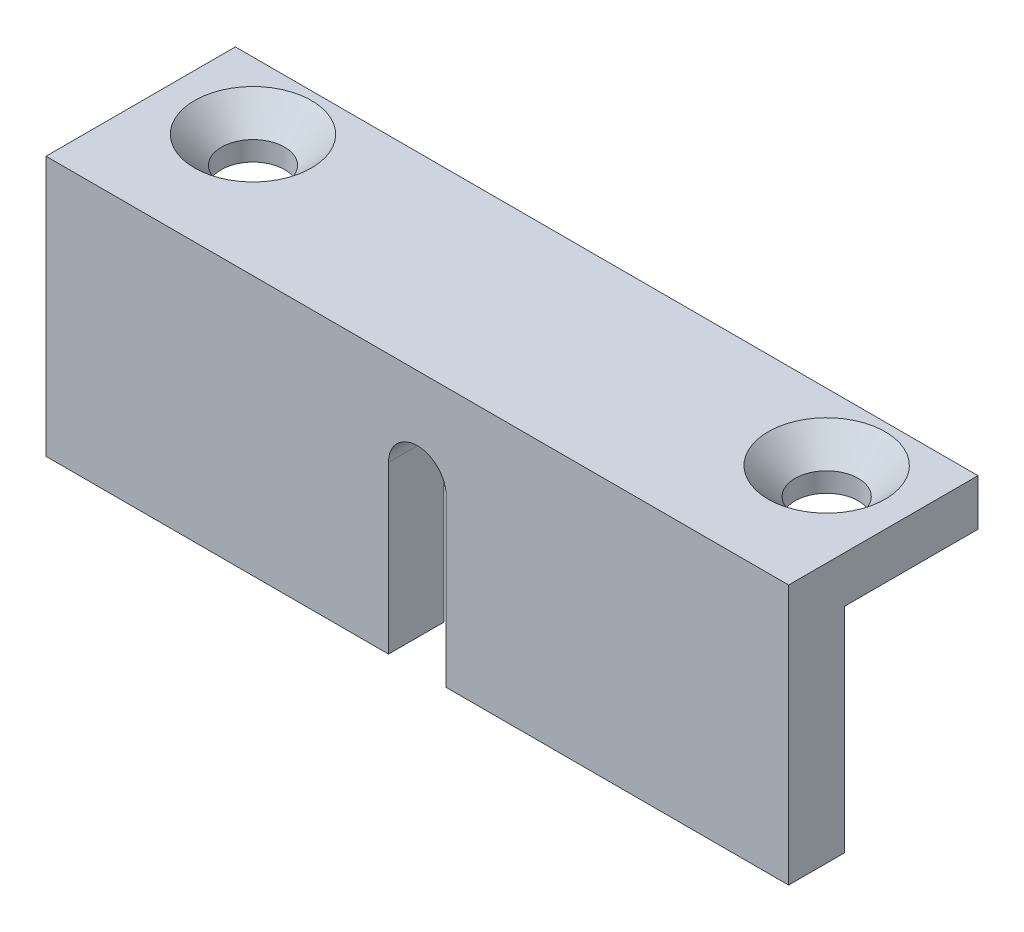
ISO-10303-21;
HEADER;
FILE_DESCRIPTION(('STEP AP214'),'2;1');
FILE_NAME('part.step','',(''),(''),'','','');
FILE_SCHEMA(('AUTOMOTIVE_DESIGN { 1 0 10303 214 1 1 1 1 }'));
ENDSEC;
DATA;
#1=APPLICATION_CONTEXT('core data for automotive mechanical design processes');
#2=APPLICATION_PROTOCOL_DEFINITION('international standard','automotive_design',2000,#1);
#3=PRODUCT_CONTEXT('',#1,'mechanical');
#4=PRODUCT('Part','Part','',(#3));
#5=PRODUCT_RELATED_PRODUCT_CATEGORY('part','',(#4));
#6=PRODUCT_DEFINITION_FORMATION('','',#4);
#7=PRODUCT_DEFINITION_CONTEXT('part definition',#1,'design');
#8=PRODUCT_DEFINITION('design','',#6,#7);
#9=PRODUCT_DEFINITION_SHAPE('','',#8);
#10=(LENGTH_UNIT() NAMED_UNIT(*) SI_UNIT(.MILLI.,.METRE.));
#11=(NAMED_UNIT(*) PLANE_ANGLE_UNIT() SI_UNIT($,.RADIAN.));
#12=(NAMED_UNIT(*) SI_UNIT($,.STERADIAN.) SOLID_ANGLE_UNIT());
#13=UNCERTAINTY_MEASURE_WITH_UNIT(LENGTH_MEASURE(1.E-05),#10,'distance_accuracy_value','');
#14=(GEOMETRIC_REPRESENTATION_CONTEXT(3) GLOBAL_UNCERTAINTY_ASSIGNED_CONTEXT((#13)) GLOBAL_UNIT_ASSIGNED_CONTEXT((#10,
#11,#12)) REPRESENTATION_CONTEXT('',''));
#15=CARTESIAN_POINT('',(0.,0.,0.));
#16=DIRECTION('',(0.,0.,1.));
#17=DIRECTION('',(1.,0.,0.));
#18=AXIS2_PLACEMENT_3D('',#15,#16,#17);
#19=CARTESIAN_POINT('',(0.,-11.5,0.));
#20=DIRECTION('',(0.,1.,0.));
#21=DIRECTION('',(0.,0.,1.));
#22=AXIS2_PLACEMENT_3D('',#19,#20,#21);
#23=PLANE('',#22);
#24=DIRECTION('',(0.,0.,-1.));
#25=VECTOR('',#24,1.);
#26=CARTESIAN_POINT('',(18.45,-11.5,0.));
#27=LINE('',#26,#25);
#28=CARTESIAN_POINT('',(18.45,-11.5,3.));
#29=VERTEX_POINT('',#28);
#30=CARTESIAN_POINT('',(18.45,-11.5,0.));
#31=VERTEX_POINT('',#30);
#32=EDGE_CURVE('E49',#29,#31,#27,.T.);
#33=ORIENTED_EDGE('',*,*,#32,.F.);
#34=DIRECTION('',(1.,0.,0.));
#35=VECTOR('',#34,1.);
#36=CARTESIAN_POINT('',(0.,-11.5,3.));
#37=LINE('',#36,#35);
#38=CARTESIAN_POINT('',(0.,-11.5,3.));
#39=VERTEX_POINT('',#38);
#40=EDGE_CURVE('E153',#39,#29,#37,.T.);
#41=ORIENTED_EDGE('',*,*,#40,.F.);
#42=DIRECTION('',(0.,0.,1.));
#43=VECTOR('',#42,1.);
#44=CARTESIAN_POINT('',(0.,-11.5,0.));
#45=LINE('',#44,#43);
#46=CARTESIAN_POINT('',(0.,-11.5,0.));
#47=VERTEX_POINT('',#46);
#48=EDGE_CURVE('E141',#47,#39,#45,.T.);
#49=ORIENTED_EDGE('',*,*,#48,.F.);
#50=DIRECTION('',(-1.,0.,0.));
#51=VECTOR('',#50,1.);
#52=CARTESIAN_POINT('',(40.,-11.5,0.));
#53=LINE('',#52,#51);
#54=EDGE_CURVE('E133',#31,#47,#53,.T.);
#55=ORIENTED_EDGE('',*,*,#54,.F.);
#56=EDGE_LOOP('',(#33,#41,#49,#55));
#57=FACE_BOUND('',#56,.T.);
#58=ADVANCED_FACE('F41',(#57),#23,.F.);
#59=CARTESIAN_POINT('',(0.,2.5,0.));
#60=DIRECTION('',(1.,0.,0.));
#61=DIRECTION('',(0.,0.,-1.));
#62=AXIS2_PLACEMENT_3D('',#59,#60,#61);
#63=PLANE('',#62);
#64=DIRECTION('',(0.,0.,1.));
#65=VECTOR('',#64,1.);
#66=CARTESIAN_POINT('',(0.,0.,0.));
#67=LINE('',#66,#65);
#68=CARTESIAN_POINT('',(0.,0.,-7.2));
#69=VERTEX_POINT('',#68);
#70=CARTESIAN_POINT('',(0.,0.,0.));
#71=VERTEX_POINT('',#70);
#72=EDGE_CURVE('E97',#69,#71,#67,.T.);
#73=ORIENTED_EDGE('',*,*,#72,.T.);
#74=DIRECTION('',(0.,1.,0.));
#75=VECTOR('',#74,1.);
#76=CARTESIAN_POINT('',(0.,-11.5,0.));
#77=LINE('',#76,#75);
#78=EDGE_CURVE('E157',#47,#71,#77,.T.);
#79=ORIENTED_EDGE('',*,*,#78,.F.);
#80=ORIENTED_EDGE('',*,*,#48,.T.);
#81=DIRECTION('',(0.,1.,0.));
#82=VECTOR('',#81,1.);
#83=CARTESIAN_POINT('',(0.,-11.5,3.));
#84=LINE('',#83,#82);
#85=CARTESIAN_POINT('',(0.,2.5,3.));
#86=VERTEX_POINT('',#85);
#87=EDGE_CURVE('E166',#39,#86,#84,.T.);
#88=ORIENTED_EDGE('',*,*,#87,.T.);
#89=DIRECTION('',(0.,0.,1.));
#90=VECTOR('',#89,1.);
#91=CARTESIAN_POINT('',(0.,2.5,0.));
#92=LINE('',#91,#90);
#93=CARTESIAN_POINT('',(0.,2.5,-7.2));
#94=VERTEX_POINT('',#93);
#95=EDGE_CURVE('E91',#94,#86,#92,.T.);
#96=ORIENTED_EDGE('',*,*,#95,.F.);
#97=DIRECTION('',(0.,-1.,0.));
#98=VECTOR('',#97,1.);
#99=CARTESIAN_POINT('',(0.,2.5,-7.2));
#100=LINE('',#99,#98);
#101=EDGE_CURVE('E84',#94,#69,#100,.T.);
#102=ORIENTED_EDGE('',*,*,#101,.T.);
#103=EDGE_LOOP('',(#73,#79,#80,#88,#96,#102));
#104=FACE_BOUND('',#103,.T.);
#105=ADVANCED_FACE('F43',(#104),#63,.F.);
#106=CARTESIAN_POINT('',(40.,2.5,0.));
#107=DIRECTION('',(-1.,0.,0.));
#108=DIRECTION('',(0.,0.,1.));
#109=AXIS2_PLACEMENT_3D('',#106,#107,#108);
#110=PLANE('',#109);
#111=DIRECTION('',(0.,0.,-1.));
#112=VECTOR('',#111,1.);
#113=CARTESIAN_POINT('',(40.,0.,0.));
#114=LINE('',#113,#112);
#115=CARTESIAN_POINT('',(40.,0.,0.));
#116=VERTEX_POINT('',#115);
#117=CARTESIAN_POINT('',(40.,0.,-7.2));
#118=VERTEX_POINT('',#117);
#119=EDGE_CURVE('E92',#116,#118,#114,.T.);
#120=ORIENTED_EDGE('',*,*,#119,.T.);
#121=DIRECTION('',(0.,-1.,0.));
#122=VECTOR('',#121,1.);
#123=CARTESIAN_POINT('',(40.,2.5,-7.2));
#124=LINE('',#123,#122);
#125=CARTESIAN_POINT('',(40.,2.5,-7.2));
#126=VERTEX_POINT('',#125);
#127=EDGE_CURVE('E87',#126,#118,#124,.T.);
#128=ORIENTED_EDGE('',*,*,#127,.F.);
#129=DIRECTION('',(0.,0.,-1.));
#130=VECTOR('',#129,1.);
#131=CARTESIAN_POINT('',(40.,2.5,0.));
#132=LINE('',#131,#130);
#133=CARTESIAN_POINT('',(40.,2.5,3.));
#134=VERTEX_POINT('',#133);
#135=EDGE_CURVE('E182',#134,#126,#132,.T.);
#136=ORIENTED_EDGE('',*,*,#135,.F.);
#137=DIRECTION('',(0.,1.,0.));
#138=VECTOR('',#137,1.);
#139=CARTESIAN_POINT('',(40.,-11.5,3.));
#140=LINE('',#139,#138);
#141=CARTESIAN_POINT('',(40.,-11.5,3.));
#142=VERTEX_POINT('',#141);
#143=EDGE_CURVE('E163',#142,#134,#140,.T.);
#144=ORIENTED_EDGE('',*,*,#143,.F.);
#145=DIRECTION('',(0.,0.,-1.));
#146=VECTOR('',#145,1.);
#147=CARTESIAN_POINT('',(40.,-11.5,3.));
#148=LINE('',#147,#146);
#149=CARTESIAN_POINT('',(40.,-11.5,0.));
#150=VERTEX_POINT('',#149);
#151=EDGE_CURVE('E155',#142,#150,#148,.T.);
#152=ORIENTED_EDGE('',*,*,#151,.T.);
#153=DIRECTION('',(0.,1.,0.));
#154=VECTOR('',#153,1.);
#155=CARTESIAN_POINT('',(40.,-11.5,0.));
#156=LINE('',#155,#154);
#157=EDGE_CURVE('E159',#150,#116,#156,.T.);
#158=ORIENTED_EDGE('',*,*,#157,.T.);
#159=EDGE_LOOP('',(#120,#128,#136,#144,#152,#158));
#160=FACE_BOUND('',#159,.T.);
#161=ADVANCED_FACE('F189',(#160),#110,.F.);
#162=CARTESIAN_POINT('',(0.,2.5,-7.2));
#163=DIRECTION('',(0.,0.,1.));
#164=DIRECTION('',(1.,0.,0.));
#165=AXIS2_PLACEMENT_3D('',#162,#163,#164);
#166=PLANE('',#165);
#167=DIRECTION('',(-1.,0.,0.));
#168=VECTOR('',#167,1.);
#169=CARTESIAN_POINT('',(0.,0.,-7.2));
#170=LINE('',#169,#168);
#171=EDGE_CURVE('E81',#118,#69,#170,.T.);
#172=ORIENTED_EDGE('',*,*,#171,.T.);
#173=ORIENTED_EDGE('',*,*,#101,.F.);
#174=DIRECTION('',(-1.,0.,0.));
#175=VECTOR('',#174,1.);
#176=CARTESIAN_POINT('',(0.,2.5,-7.2));
#177=LINE('',#176,#175);
#178=EDGE_CURVE('E65',#126,#94,#177,.T.);
#179=ORIENTED_EDGE('',*,*,#178,.F.);
#180=ORIENTED_EDGE('',*,*,#127,.T.);
#181=EDGE_LOOP('',(#172,#173,#179,#180));
#182=FACE_BOUND('',#181,.T.);
#183=ADVANCED_FACE('F83',(#182),#166,.F.);
#184=CARTESIAN_POINT('',(0.,2.5,0.));
#185=DIRECTION('',(0.,-1.,0.));
#186=DIRECTION('',(0.,0.,-1.));
#187=AXIS2_PLACEMENT_3D('',#184,#185,#186);
#188=PLANE('',#187);
#189=CARTESIAN_POINT('',(4.55,2.5,-3.6));
#190=DIRECTION('',(0.,1.,0.));
#191=DIRECTION('',(0.,0.,1.));
#192=AXIS2_PLACEMENT_3D('',#189,#190,#191);
#193=CIRCLE('',#192,3.15);
#194=CARTESIAN_POINT('',(4.55,2.5,-0.45));
#195=VERTEX_POINT('',#194);
#196=EDGE_CURVE('E162',#195,#195,#193,.T.);
#197=ORIENTED_EDGE('',*,*,#196,.F.);
#198=EDGE_LOOP('',(#197));
#199=FACE_BOUND('',#198,.T.);
#200=CARTESIAN_POINT('',(35.45,2.5,-3.6));
#201=DIRECTION('',(0.,1.,0.));
#202=DIRECTION('',(0.,0.,1.));
#203=AXIS2_PLACEMENT_3D('',#200,#201,#202);
#204=CIRCLE('',#203,3.15);
#205=CARTESIAN_POINT('',(35.45,2.5,-0.450000000000004));
#206=VERTEX_POINT('',#205);
#207=EDGE_CURVE('E177',#206,#206,#204,.T.);
#208=ORIENTED_EDGE('',*,*,#207,.F.);
#209=EDGE_LOOP('',(#208));
#210=FACE_BOUND('',#209,.T.);
#211=ORIENTED_EDGE('',*,*,#95,.T.);
#212=DIRECTION('',(1.,0.,0.));
#213=VECTOR('',#212,1.);
#214=CARTESIAN_POINT('',(0.,2.5,3.));
#215=LINE('',#214,#213);
#216=EDGE_CURVE('E143',#86,#134,#215,.T.);
#217=ORIENTED_EDGE('',*,*,#216,.T.);
#218=ORIENTED_EDGE('',*,*,#135,.T.);
#219=ORIENTED_EDGE('',*,*,#178,.T.);
#220=EDGE_LOOP('',(#211,#217,#218,#219));
#221=FACE_BOUND('',#220,.T.);
#222=ADVANCED_FACE('F184',(#199,#210,#221),#188,.F.);
#223=CARTESIAN_POINT('',(0.,0.,0.));
#224=DIRECTION('',(0.,-1.,0.));
#225=DIRECTION('',(0.,0.,-1.));
#226=AXIS2_PLACEMENT_3D('',#223,#224,#225);
#227=PLANE('',#226);
#228=CARTESIAN_POINT('',(4.55,0.,-3.6));
#229=DIRECTION('',(0.,1.,0.));
#230=DIRECTION('',(0.,0.,1.));
#231=AXIS2_PLACEMENT_3D('',#228,#229,#230);
#232=CIRCLE('',#231,1.7);
#233=CARTESIAN_POINT('',(4.55,0.,-1.9));
#234=VERTEX_POINT('',#233);
#235=EDGE_CURVE('E174',#234,#234,#232,.T.);
#236=ORIENTED_EDGE('',*,*,#235,.T.);
#237=EDGE_LOOP('',(#236));
#238=FACE_BOUND('',#237,.T.);
#239=CARTESIAN_POINT('',(35.45,0.,-3.6));
#240=DIRECTION('',(0.,1.,0.));
#241=DIRECTION('',(0.,0.,1.));
#242=AXIS2_PLACEMENT_3D('',#239,#240,#241);
#243=CIRCLE('',#242,1.7);
#244=CARTESIAN_POINT('',(35.45,0.,-1.9));
#245=VERTEX_POINT('',#244);
#246=EDGE_CURVE('E104',#245,#245,#243,.T.);
#247=ORIENTED_EDGE('',*,*,#246,.T.);
#248=EDGE_LOOP('',(#247));
#249=FACE_BOUND('',#248,.T.);
#250=ORIENTED_EDGE('',*,*,#72,.F.);
#251=ORIENTED_EDGE('',*,*,#171,.F.);
#252=ORIENTED_EDGE('',*,*,#119,.F.);
#253=DIRECTION('',(1.,0.,0.));
#254=VECTOR('',#253,1.);
#255=CARTESIAN_POINT('',(0.,0.,0.));
#256=LINE('',#255,#254);
#257=EDGE_CURVE('E103',#71,#116,#256,.T.);
#258=ORIENTED_EDGE('',*,*,#257,.F.);
#259=EDGE_LOOP('',(#250,#251,#252,#258));
#260=FACE_BOUND('',#259,.T.);
#261=ADVANCED_FACE('F101',(#238,#249,#260),#227,.T.);
#262=CARTESIAN_POINT('',(35.45,2.5,-3.6));
#263=DIRECTION('',(0.,1.,0.));
#264=DIRECTION('',(0.,0.,1.));
#265=AXIS2_PLACEMENT_3D('',#262,#263,#264);
#266=CYLINDRICAL_SURFACE('',#265,1.7);
#267=ORIENTED_EDGE('',*,*,#246,.F.);
#268=EDGE_LOOP('',(#267));
#269=FACE_BOUND('',#268,.T.);
#270=CARTESIAN_POINT('',(35.45,1.05,-3.6));
#271=DIRECTION('',(0.,1.,0.));
#272=DIRECTION('',(0.,0.,1.));
#273=AXIS2_PLACEMENT_3D('',#270,#271,#272);
#274=CIRCLE('',#273,1.7);
#275=CARTESIAN_POINT('',(35.45,1.05,-1.9));
#276=VERTEX_POINT('',#275);
#277=EDGE_CURVE('E108',#276,#276,#274,.T.);
#278=ORIENTED_EDGE('',*,*,#277,.T.);
#279=EDGE_LOOP('',(#278));
#280=FACE_BOUND('',#279,.T.);
#281=ADVANCED_FACE('F265',(#269,#280),#266,.F.);
#282=CARTESIAN_POINT('',(35.45,2.5,-3.6));
#283=DIRECTION('',(0.,1.,0.));
#284=DIRECTION('',(0.,0.,1.));
#285=AXIS2_PLACEMENT_3D('',#282,#283,#284);
#286=CONICAL_SURFACE('',#285,3.15,0.785398163397449);
#287=ORIENTED_EDGE('',*,*,#277,.F.);
#288=EDGE_LOOP('',(#287));
#289=FACE_BOUND('',#288,.T.);
#290=ORIENTED_EDGE('',*,*,#207,.T.);
#291=EDGE_LOOP('',(#290));
#292=FACE_BOUND('',#291,.T.);
#293=ADVANCED_FACE('F271',(#289,#292),#286,.F.);
#294=CARTESIAN_POINT('',(4.55,2.5,-3.6));
#295=DIRECTION('',(0.,1.,0.));
#296=DIRECTION('',(0.,0.,1.));
#297=AXIS2_PLACEMENT_3D('',#294,#295,#296);
#298=CYLINDRICAL_SURFACE('',#297,1.7);
#299=ORIENTED_EDGE('',*,*,#235,.F.);
#300=EDGE_LOOP('',(#299));
#301=FACE_BOUND('',#300,.T.);
#302=CARTESIAN_POINT('',(4.55,1.05,-3.6));
#303=DIRECTION('',(0.,1.,0.));
#304=DIRECTION('',(0.,0.,1.));
#305=AXIS2_PLACEMENT_3D('',#302,#303,#304);
#306=CIRCLE('',#305,1.7);
#307=CARTESIAN_POINT('',(4.55,1.05,-1.9));
#308=VERTEX_POINT('',#307);
#309=EDGE_CURVE('E171',#308,#308,#306,.T.);
#310=ORIENTED_EDGE('',*,*,#309,.T.);
#311=EDGE_LOOP('',(#310));
#312=FACE_BOUND('',#311,.T.);
#313=ADVANCED_FACE('F275',(#301,#312),#298,.F.);
#314=CARTESIAN_POINT('',(4.55,2.5,-3.6));
#315=DIRECTION('',(0.,1.,0.));
#316=DIRECTION('',(0.,0.,1.));
#317=AXIS2_PLACEMENT_3D('',#314,#315,#316);
#318=CONICAL_SURFACE('',#317,3.15,0.785398163397449);
#319=ORIENTED_EDGE('',*,*,#309,.F.);
#320=EDGE_LOOP('',(#319));
#321=FACE_BOUND('',#320,.T.);
#322=ORIENTED_EDGE('',*,*,#196,.T.);
#323=EDGE_LOOP('',(#322));
#324=FACE_BOUND('',#323,.T.);
#325=ADVANCED_FACE('F279',(#321,#324),#318,.F.);
#326=CARTESIAN_POINT('',(40.,-11.5,0.));
#327=DIRECTION('',(0.,0.,-1.));
#328=DIRECTION('',(-1.,0.,0.));
#329=AXIS2_PLACEMENT_3D('',#326,#327,#328);
#330=PLANE('',#329);
#331=DIRECTION('',(0.,-1.,0.));
#332=VECTOR('',#331,1.);
#333=CARTESIAN_POINT('',(21.55,-11.5,0.));
#334=LINE('',#333,#332);
#335=CARTESIAN_POINT('',(21.55,-2.55,0.));
#336=VERTEX_POINT('',#335);
#337=CARTESIAN_POINT('',(21.55,-11.5,0.));
#338=VERTEX_POINT('',#337);
#339=EDGE_CURVE('E136',#336,#338,#334,.T.);
#340=ORIENTED_EDGE('',*,*,#339,.F.);
#341=CARTESIAN_POINT('',(20.,-2.55,0.));
#342=DIRECTION('',(0.,0.,-1.));
#343=DIRECTION('',(-1.,0.,0.));
#344=AXIS2_PLACEMENT_3D('',#341,#342,#343);
#345=CIRCLE('',#344,1.55);
#346=CARTESIAN_POINT('',(18.45,-2.55,0.));
#347=VERTEX_POINT('',#346);
#348=EDGE_CURVE('E135',#347,#336,#345,.T.);
#349=ORIENTED_EDGE('',*,*,#348,.F.);
#350=DIRECTION('',(0.,-1.,0.));
#351=VECTOR('',#350,1.);
#352=CARTESIAN_POINT('',(18.45,-11.5,0.));
#353=LINE('',#352,#351);
#354=EDGE_CURVE('E119',#347,#31,#353,.T.);
#355=ORIENTED_EDGE('',*,*,#354,.T.);
#356=ORIENTED_EDGE('',*,*,#54,.T.);
#357=ORIENTED_EDGE('',*,*,#78,.T.);
#358=ORIENTED_EDGE('',*,*,#257,.T.);
#359=ORIENTED_EDGE('',*,*,#157,.F.);
#360=EDGE_CURVE('E142',#150,#338,#53,.T.);
#361=ORIENTED_EDGE('',*,*,#360,.T.);
#362=EDGE_LOOP('',(#340,#349,#355,#356,#357,#358,#359,#361));
#363=FACE_BOUND('',#362,.T.);
#364=ADVANCED_FACE('F131',(#363),#330,.T.);
#365=CARTESIAN_POINT('',(0.,-11.5,3.));
#366=DIRECTION('',(0.,0.,1.));
#367=DIRECTION('',(1.,0.,0.));
#368=AXIS2_PLACEMENT_3D('',#365,#366,#367);
#369=PLANE('',#368);
#370=DIRECTION('',(0.,1.,0.));
#371=VECTOR('',#370,1.);
#372=CARTESIAN_POINT('',(21.55,0.,3.));
#373=LINE('',#372,#371);
#374=CARTESIAN_POINT('',(21.55,-11.5,3.));
#375=VERTEX_POINT('',#374);
#376=CARTESIAN_POINT('',(21.55,-2.55,3.));
#377=VERTEX_POINT('',#376);
#378=EDGE_CURVE('E228',#375,#377,#373,.T.);
#379=ORIENTED_EDGE('',*,*,#378,.F.);
#380=EDGE_CURVE('E152',#375,#142,#37,.T.);
#381=ORIENTED_EDGE('',*,*,#380,.T.);
#382=ORIENTED_EDGE('',*,*,#143,.T.);
#383=ORIENTED_EDGE('',*,*,#216,.F.);
#384=ORIENTED_EDGE('',*,*,#87,.F.);
#385=ORIENTED_EDGE('',*,*,#40,.T.);
#386=DIRECTION('',(0.,1.,0.));
#387=VECTOR('',#386,1.);
#388=CARTESIAN_POINT('',(18.45,0.,3.));
#389=LINE('',#388,#387);
#390=CARTESIAN_POINT('',(18.45,-2.55,3.));
#391=VERTEX_POINT('',#390);
#392=EDGE_CURVE('E56',#29,#391,#389,.T.);
#393=ORIENTED_EDGE('',*,*,#392,.T.);
#394=CARTESIAN_POINT('',(20.,-2.55,3.));
#395=DIRECTION('',(0.,0.,1.));
#396=DIRECTION('',(1.,0.,0.));
#397=AXIS2_PLACEMENT_3D('',#394,#395,#396);
#398=CIRCLE('',#397,1.55);
#399=EDGE_CURVE('E225',#377,#391,#398,.T.);
#400=ORIENTED_EDGE('',*,*,#399,.F.);
#401=EDGE_LOOP('',(#379,#381,#382,#383,#384,#385,#393,#400));
#402=FACE_BOUND('',#401,.T.);
#403=ADVANCED_FACE('F233',(#402),#369,.T.);
#404=ORIENTED_EDGE('',*,*,#380,.F.);
#405=DIRECTION('',(0.,0.,-1.));
#406=VECTOR('',#405,1.);
#407=CARTESIAN_POINT('',(21.55,-11.5,0.));
#408=LINE('',#407,#406);
#409=EDGE_CURVE('E11',#375,#338,#408,.T.);
#410=ORIENTED_EDGE('',*,*,#409,.T.);
#411=ORIENTED_EDGE('',*,*,#360,.F.);
#412=ORIENTED_EDGE('',*,*,#151,.F.);
#413=EDGE_LOOP('',(#404,#410,#411,#412));
#414=FACE_BOUND('',#413,.T.);
#415=ADVANCED_FACE('F239',(#414),#23,.F.);
#416=CARTESIAN_POINT('',(21.55,0.,-7.2));
#417=DIRECTION('',(1.,0.,0.));
#418=DIRECTION('',(0.,0.,-1.));
#419=AXIS2_PLACEMENT_3D('',#416,#417,#418);
#420=PLANE('',#419);
#421=ORIENTED_EDGE('',*,*,#339,.T.);
#422=ORIENTED_EDGE('',*,*,#409,.F.);
#423=ORIENTED_EDGE('',*,*,#378,.T.);
#424=DIRECTION('',(0.,0.,1.));
#425=VECTOR('',#424,1.);
#426=CARTESIAN_POINT('',(21.55,-2.55,-7.2));
#427=LINE('',#426,#425);
#428=EDGE_CURVE('E221',#336,#377,#427,.T.);
#429=ORIENTED_EDGE('',*,*,#428,.F.);
#430=EDGE_LOOP('',(#421,#422,#423,#429));
#431=FACE_BOUND('',#430,.T.);
#432=ADVANCED_FACE('F229',(#431),#420,.F.);
#433=CARTESIAN_POINT('',(18.45,0.,-7.2));
#434=DIRECTION('',(1.,0.,0.));
#435=DIRECTION('',(0.,0.,-1.));
#436=AXIS2_PLACEMENT_3D('',#433,#434,#435);
#437=PLANE('',#436);
#438=DIRECTION('',(0.,0.,1.));
#439=VECTOR('',#438,1.);
#440=CARTESIAN_POINT('',(18.45,-2.55,-7.2));
#441=LINE('',#440,#439);
#442=EDGE_CURVE('E137',#347,#391,#441,.T.);
#443=ORIENTED_EDGE('',*,*,#442,.T.);
#444=ORIENTED_EDGE('',*,*,#392,.F.);
#445=ORIENTED_EDGE('',*,*,#32,.T.);
#446=ORIENTED_EDGE('',*,*,#354,.F.);
#447=EDGE_LOOP('',(#443,#444,#445,#446));
#448=FACE_BOUND('',#447,.T.);
#449=ADVANCED_FACE('F117',(#448),#437,.T.);
#450=CARTESIAN_POINT('',(20.,-2.55,-7.2));
#451=DIRECTION('',(0.,0.,1.));
#452=DIRECTION('',(1.,0.,0.));
#453=AXIS2_PLACEMENT_3D('',#450,#451,#452);
#454=CYLINDRICAL_SURFACE('',#453,1.55);
#455=ORIENTED_EDGE('',*,*,#348,.T.);
#456=ORIENTED_EDGE('',*,*,#428,.T.);
#457=ORIENTED_EDGE('',*,*,#399,.T.);
#458=ORIENTED_EDGE('',*,*,#442,.F.);
#459=EDGE_LOOP('',(#455,#456,#457,#458));
#460=FACE_BOUND('',#459,.T.);
#461=ADVANCED_FACE('F223',(#460),#454,.F.);
#462=CLOSED_SHELL('',(#58,#105,#161,#183,#222,#261,#281,#293,#313,#325,#364,#403,#415,#432,#449,#461));
#463=MANIFOLD_SOLID_BREP('B2',#462);
#464=ADVANCED_BREP_SHAPE_REPRESENTATION('',(#18,#463),#14);
#465=SHAPE_DEFINITION_REPRESENTATION(#9,#464);
ENDSEC;
END-ISO-10303-21;
